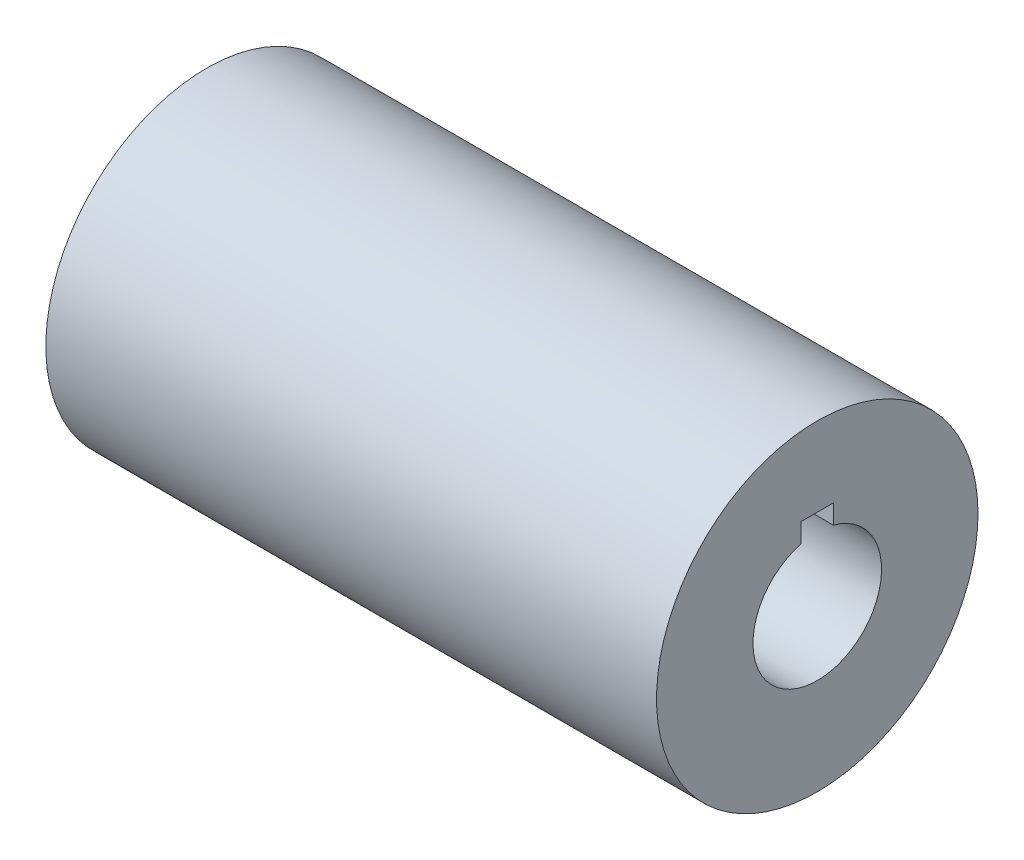
ISO-10303-21;
HEADER;
FILE_DESCRIPTION(('STEP AP214'),'2;1');
FILE_NAME('part.step','',(''),(''),'','','');
FILE_SCHEMA(('AUTOMOTIVE_DESIGN { 1 0 10303 214 1 1 1 1 }'));
ENDSEC;
DATA;
#1=APPLICATION_CONTEXT('core data for automotive mechanical design processes');
#2=APPLICATION_PROTOCOL_DEFINITION('international standard','automotive_design',2000,#1);
#3=PRODUCT_CONTEXT('',#1,'mechanical');
#4=PRODUCT('Part','Part','',(#3));
#5=PRODUCT_RELATED_PRODUCT_CATEGORY('part','',(#4));
#6=PRODUCT_DEFINITION_FORMATION('','',#4);
#7=PRODUCT_DEFINITION_CONTEXT('part definition',#1,'design');
#8=PRODUCT_DEFINITION('design','',#6,#7);
#9=PRODUCT_DEFINITION_SHAPE('','',#8);
#10=(LENGTH_UNIT() NAMED_UNIT(*) SI_UNIT(.MILLI.,.METRE.));
#11=(NAMED_UNIT(*) PLANE_ANGLE_UNIT() SI_UNIT($,.RADIAN.));
#12=(NAMED_UNIT(*) SI_UNIT($,.STERADIAN.) SOLID_ANGLE_UNIT());
#13=UNCERTAINTY_MEASURE_WITH_UNIT(LENGTH_MEASURE(1.E-05),#10,'distance_accuracy_value','');
#14=(GEOMETRIC_REPRESENTATION_CONTEXT(3) GLOBAL_UNCERTAINTY_ASSIGNED_CONTEXT((#13)) GLOBAL_UNIT_ASSIGNED_CONTEXT((#10,
#11,#12)) REPRESENTATION_CONTEXT('',''));
#15=CARTESIAN_POINT('',(0.,0.,0.));
#16=DIRECTION('',(0.,0.,1.));
#17=DIRECTION('',(1.,0.,0.));
#18=AXIS2_PLACEMENT_3D('',#15,#16,#17);
#19=CARTESIAN_POINT('',(0.,0.,0.));
#20=DIRECTION('',(1.,0.,0.));
#21=DIRECTION('',(0.,0.,-1.));
#22=AXIS2_PLACEMENT_3D('',#19,#20,#21);
#23=CYLINDRICAL_SURFACE('',#22,4.);
#24=CARTESIAN_POINT('',(38.,0.,0.));
#25=DIRECTION('',(1.,0.,0.));
#26=DIRECTION('',(0.,0.,-1.));
#27=AXIS2_PLACEMENT_3D('',#24,#25,#26);
#28=CIRCLE('',#27,4.);
#29=CARTESIAN_POINT('',(38.,3.87298334620742,1.));
#30=VERTEX_POINT('',#29);
#31=CARTESIAN_POINT('',(38.,3.87298334620742,-1.));
#32=VERTEX_POINT('',#31);
#33=EDGE_CURVE('E122',#30,#32,#28,.T.);
#34=ORIENTED_EDGE('',*,*,#33,.T.);
#35=DIRECTION('',(1.,0.,0.));
#36=VECTOR('',#35,1.);
#37=CARTESIAN_POINT('',(18.,3.87298334620742,-1.));
#38=LINE('',#37,#36);
#39=CARTESIAN_POINT('',(18.,3.87298334620742,-1.));
#40=VERTEX_POINT('',#39);
#41=EDGE_CURVE('E112',#40,#32,#38,.T.);
#42=ORIENTED_EDGE('',*,*,#41,.F.);
#43=CARTESIAN_POINT('',(18.,0.,0.));
#44=DIRECTION('',(-1.,0.,0.));
#45=DIRECTION('',(0.,0.,1.));
#46=AXIS2_PLACEMENT_3D('',#43,#44,#45);
#47=CIRCLE('',#46,4.);
#48=CARTESIAN_POINT('',(18.,3.87298334620742,1.));
#49=VERTEX_POINT('',#48);
#50=EDGE_CURVE('E37',#49,#40,#47,.F.);
#51=ORIENTED_EDGE('',*,*,#50,.F.);
#52=DIRECTION('',(1.,0.,0.));
#53=VECTOR('',#52,1.);
#54=CARTESIAN_POINT('',(18.,3.87298334620742,1.));
#55=LINE('',#54,#53);
#56=EDGE_CURVE('E102',#49,#30,#55,.T.);
#57=ORIENTED_EDGE('',*,*,#56,.T.);
#58=EDGE_LOOP('',(#34,#42,#51,#57));
#59=FACE_BOUND('',#58,.T.);
#60=ADVANCED_FACE('F33',(#59),#23,.F.);
#61=CARTESIAN_POINT('',(38.,0.,0.));
#62=DIRECTION('',(-1.,0.,0.));
#63=DIRECTION('',(0.,0.,1.));
#64=AXIS2_PLACEMENT_3D('',#61,#62,#63);
#65=CYLINDRICAL_SURFACE('',#64,10.);
#66=CARTESIAN_POINT('',(38.,0.,0.));
#67=DIRECTION('',(1.,0.,0.));
#68=DIRECTION('',(0.,0.,-1.));
#69=AXIS2_PLACEMENT_3D('',#66,#67,#68);
#70=CIRCLE('',#69,10.);
#71=CARTESIAN_POINT('',(38.,0.,-10.));
#72=VERTEX_POINT('',#71);
#73=EDGE_CURVE('E11',#72,#72,#70,.T.);
#74=ORIENTED_EDGE('',*,*,#73,.F.);
#75=EDGE_LOOP('',(#74));
#76=FACE_BOUND('',#75,.T.);
#77=CARTESIAN_POINT('',(0.,0.,0.));
#78=DIRECTION('',(1.,0.,0.));
#79=DIRECTION('',(0.,0.,-1.));
#80=AXIS2_PLACEMENT_3D('',#77,#78,#79);
#81=CIRCLE('',#80,10.);
#82=CARTESIAN_POINT('',(0.,0.,-10.));
#83=VERTEX_POINT('',#82);
#84=EDGE_CURVE('E42',#83,#83,#81,.T.);
#85=ORIENTED_EDGE('',*,*,#84,.T.);
#86=EDGE_LOOP('',(#85));
#87=FACE_BOUND('',#86,.T.);
#88=ADVANCED_FACE('F35',(#76,#87),#65,.T.);
#89=CARTESIAN_POINT('',(38.,0.,0.));
#90=DIRECTION('',(1.,0.,0.));
#91=DIRECTION('',(0.,0.,-1.));
#92=AXIS2_PLACEMENT_3D('',#89,#90,#91);
#93=PLANE('',#92);
#94=DIRECTION('',(0.,-1.,0.));
#95=VECTOR('',#94,1.);
#96=CARTESIAN_POINT('',(38.,3.87298334620742,1.));
#97=LINE('',#96,#95);
#98=CARTESIAN_POINT('',(38.,5.07298334620742,1.));
#99=VERTEX_POINT('',#98);
#100=EDGE_CURVE('E107',#99,#30,#97,.T.);
#101=ORIENTED_EDGE('',*,*,#100,.F.);
#102=DIRECTION('',(0.,0.,1.));
#103=VECTOR('',#102,1.);
#104=CARTESIAN_POINT('',(38.,5.07298334620742,1.));
#105=LINE('',#104,#103);
#106=CARTESIAN_POINT('',(38.,5.07298334620742,-1.));
#107=VERTEX_POINT('',#106);
#108=EDGE_CURVE('E119',#107,#99,#105,.T.);
#109=ORIENTED_EDGE('',*,*,#108,.F.);
#110=DIRECTION('',(0.,1.,0.));
#111=VECTOR('',#110,1.);
#112=CARTESIAN_POINT('',(38.,3.87298334620742,-1.));
#113=LINE('',#112,#111);
#114=EDGE_CURVE('E190',#32,#107,#113,.T.);
#115=ORIENTED_EDGE('',*,*,#114,.F.);
#116=ORIENTED_EDGE('',*,*,#33,.F.);
#117=EDGE_LOOP('',(#101,#109,#115,#116));
#118=FACE_BOUND('',#117,.T.);
#119=ORIENTED_EDGE('',*,*,#73,.T.);
#120=EDGE_LOOP('',(#119));
#121=FACE_BOUND('',#120,.T.);
#122=ADVANCED_FACE('F141',(#118,#121),#93,.T.);
#123=CARTESIAN_POINT('',(0.,0.,0.));
#124=DIRECTION('',(1.,0.,0.));
#125=DIRECTION('',(0.,0.,-1.));
#126=AXIS2_PLACEMENT_3D('',#123,#124,#125);
#127=PLANE('',#126);
#128=CARTESIAN_POINT('',(0.,0.,0.));
#129=DIRECTION('',(-1.,0.,0.));
#130=DIRECTION('',(0.,0.,1.));
#131=AXIS2_PLACEMENT_3D('',#128,#129,#130);
#132=CIRCLE('',#131,4.5);
#133=CARTESIAN_POINT('',(0.,4.24264068711928,-1.5));
#134=VERTEX_POINT('',#133);
#135=CARTESIAN_POINT('',(0.,4.24264068711928,1.5));
#136=VERTEX_POINT('',#135);
#137=EDGE_CURVE('E125',#134,#136,#132,.T.);
#138=ORIENTED_EDGE('',*,*,#137,.F.);
#139=DIRECTION('',(0.,-1.,0.));
#140=VECTOR('',#139,1.);
#141=CARTESIAN_POINT('',(0.,4.24264068711928,-1.5));
#142=LINE('',#141,#140);
#143=CARTESIAN_POINT('',(0.,5.84264068711928,-1.5));
#144=VERTEX_POINT('',#143);
#145=EDGE_CURVE('E199',#144,#134,#142,.T.);
#146=ORIENTED_EDGE('',*,*,#145,.F.);
#147=DIRECTION('',(0.,0.,-1.));
#148=VECTOR('',#147,1.);
#149=CARTESIAN_POINT('',(0.,5.84264068711928,-1.5));
#150=LINE('',#149,#148);
#151=CARTESIAN_POINT('',(0.,5.84264068711928,1.5));
#152=VERTEX_POINT('',#151);
#153=EDGE_CURVE('E204',#152,#144,#150,.T.);
#154=ORIENTED_EDGE('',*,*,#153,.F.);
#155=DIRECTION('',(0.,1.,0.));
#156=VECTOR('',#155,1.);
#157=CARTESIAN_POINT('',(0.,4.24264068711928,1.5));
#158=LINE('',#157,#156);
#159=EDGE_CURVE('E209',#136,#152,#158,.T.);
#160=ORIENTED_EDGE('',*,*,#159,.F.);
#161=EDGE_LOOP('',(#138,#146,#154,#160));
#162=FACE_BOUND('',#161,.T.);
#163=ORIENTED_EDGE('',*,*,#84,.F.);
#164=EDGE_LOOP('',(#163));
#165=FACE_BOUND('',#164,.T.);
#166=ADVANCED_FACE('F139',(#162,#165),#127,.F.);
#167=CARTESIAN_POINT('',(18.,0.,0.));
#168=DIRECTION('',(-1.,0.,0.));
#169=DIRECTION('',(0.,0.,1.));
#170=AXIS2_PLACEMENT_3D('',#167,#168,#169);
#171=PLANE('',#170);
#172=DIRECTION('',(0.,-1.,0.));
#173=VECTOR('',#172,1.);
#174=CARTESIAN_POINT('',(18.,3.87298334620742,1.));
#175=LINE('',#174,#173);
#176=CARTESIAN_POINT('',(18.,5.07298334620742,1.));
#177=VERTEX_POINT('',#176);
#178=EDGE_CURVE('E105',#177,#49,#175,.T.);
#179=ORIENTED_EDGE('',*,*,#178,.T.);
#180=ORIENTED_EDGE('',*,*,#50,.T.);
#181=DIRECTION('',(0.,1.,0.));
#182=VECTOR('',#181,1.);
#183=CARTESIAN_POINT('',(18.,3.87298334620742,-1.));
#184=LINE('',#183,#182);
#185=CARTESIAN_POINT('',(18.,5.07298334620742,-1.));
#186=VERTEX_POINT('',#185);
#187=EDGE_CURVE('E118',#40,#186,#184,.T.);
#188=ORIENTED_EDGE('',*,*,#187,.T.);
#189=DIRECTION('',(0.,0.,1.));
#190=VECTOR('',#189,1.);
#191=CARTESIAN_POINT('',(18.,5.07298334620742,1.));
#192=LINE('',#191,#190);
#193=EDGE_CURVE('E50',#186,#177,#192,.T.);
#194=ORIENTED_EDGE('',*,*,#193,.T.);
#195=EDGE_LOOP('',(#179,#180,#188,#194));
#196=FACE_BOUND('',#195,.T.);
#197=CARTESIAN_POINT('',(18.,0.,0.));
#198=DIRECTION('',(-1.,0.,0.));
#199=DIRECTION('',(0.,0.,1.));
#200=AXIS2_PLACEMENT_3D('',#197,#198,#199);
#201=CIRCLE('',#200,4.5);
#202=CARTESIAN_POINT('',(18.,4.24264068711928,-1.5));
#203=VERTEX_POINT('',#202);
#204=CARTESIAN_POINT('',(18.,4.24264068711928,1.5));
#205=VERTEX_POINT('',#204);
#206=EDGE_CURVE('E123',#203,#205,#201,.T.);
#207=ORIENTED_EDGE('',*,*,#206,.T.);
#208=DIRECTION('',(0.,1.,0.));
#209=VECTOR('',#208,1.);
#210=CARTESIAN_POINT('',(18.,4.24264068711928,1.5));
#211=LINE('',#210,#209);
#212=CARTESIAN_POINT('',(18.,5.84264068711928,1.5));
#213=VERTEX_POINT('',#212);
#214=EDGE_CURVE('E203',#205,#213,#211,.T.);
#215=ORIENTED_EDGE('',*,*,#214,.T.);
#216=DIRECTION('',(0.,0.,-1.));
#217=VECTOR('',#216,1.);
#218=CARTESIAN_POINT('',(18.,5.84264068711928,-1.5));
#219=LINE('',#218,#217);
#220=CARTESIAN_POINT('',(18.,5.84264068711928,-1.5));
#221=VERTEX_POINT('',#220);
#222=EDGE_CURVE('E206',#213,#221,#219,.T.);
#223=ORIENTED_EDGE('',*,*,#222,.T.);
#224=DIRECTION('',(0.,-1.,0.));
#225=VECTOR('',#224,1.);
#226=CARTESIAN_POINT('',(18.,4.24264068711928,-1.5));
#227=LINE('',#226,#225);
#228=EDGE_CURVE('E58',#221,#203,#227,.T.);
#229=ORIENTED_EDGE('',*,*,#228,.T.);
#230=EDGE_LOOP('',(#207,#215,#223,#229));
#231=FACE_BOUND('',#230,.T.);
#232=ADVANCED_FACE('F116',(#196,#231),#171,.T.);
#233=CARTESIAN_POINT('',(18.,0.,0.));
#234=DIRECTION('',(-1.,0.,0.));
#235=DIRECTION('',(0.,0.,1.));
#236=AXIS2_PLACEMENT_3D('',#233,#234,#235);
#237=CYLINDRICAL_SURFACE('',#236,4.5);
#238=ORIENTED_EDGE('',*,*,#137,.T.);
#239=DIRECTION('',(-1.,0.,0.));
#240=VECTOR('',#239,1.);
#241=CARTESIAN_POINT('',(18.,4.24264068711928,1.5));
#242=LINE('',#241,#240);
#243=EDGE_CURVE('E216',#205,#136,#242,.T.);
#244=ORIENTED_EDGE('',*,*,#243,.F.);
#245=ORIENTED_EDGE('',*,*,#206,.F.);
#246=DIRECTION('',(-1.,0.,0.));
#247=VECTOR('',#246,1.);
#248=CARTESIAN_POINT('',(18.,4.24264068711928,-1.5));
#249=LINE('',#248,#247);
#250=EDGE_CURVE('E133',#203,#134,#249,.T.);
#251=ORIENTED_EDGE('',*,*,#250,.T.);
#252=EDGE_LOOP('',(#238,#244,#245,#251));
#253=FACE_BOUND('',#252,.T.);
#254=ADVANCED_FACE('F147',(#253),#237,.F.);
#255=CARTESIAN_POINT('',(18.,4.24264068711928,-1.5));
#256=DIRECTION('',(0.,0.,-1.));
#257=DIRECTION('',(-1.,0.,0.));
#258=AXIS2_PLACEMENT_3D('',#255,#256,#257);
#259=PLANE('',#258);
#260=ORIENTED_EDGE('',*,*,#145,.T.);
#261=ORIENTED_EDGE('',*,*,#250,.F.);
#262=ORIENTED_EDGE('',*,*,#228,.F.);
#263=DIRECTION('',(-1.,0.,0.));
#264=VECTOR('',#263,1.);
#265=CARTESIAN_POINT('',(18.,5.84264068711928,-1.5));
#266=LINE('',#265,#264);
#267=EDGE_CURVE('E130',#221,#144,#266,.T.);
#268=ORIENTED_EDGE('',*,*,#267,.T.);
#269=EDGE_LOOP('',(#260,#261,#262,#268));
#270=FACE_BOUND('',#269,.T.);
#271=ADVANCED_FACE('F160',(#270),#259,.F.);
#272=CARTESIAN_POINT('',(18.,5.84264068711928,-1.5));
#273=DIRECTION('',(0.,1.,0.));
#274=DIRECTION('',(0.,0.,1.));
#275=AXIS2_PLACEMENT_3D('',#272,#273,#274);
#276=PLANE('',#275);
#277=ORIENTED_EDGE('',*,*,#153,.T.);
#278=ORIENTED_EDGE('',*,*,#267,.F.);
#279=ORIENTED_EDGE('',*,*,#222,.F.);
#280=DIRECTION('',(-1.,0.,0.));
#281=VECTOR('',#280,1.);
#282=CARTESIAN_POINT('',(18.,5.84264068711928,1.5));
#283=LINE('',#282,#281);
#284=EDGE_CURVE('E215',#213,#152,#283,.T.);
#285=ORIENTED_EDGE('',*,*,#284,.T.);
#286=EDGE_LOOP('',(#277,#278,#279,#285));
#287=FACE_BOUND('',#286,.T.);
#288=ADVANCED_FACE('F165',(#287),#276,.F.);
#289=CARTESIAN_POINT('',(18.,4.24264068711928,1.5));
#290=DIRECTION('',(0.,0.,1.));
#291=DIRECTION('',(1.,0.,0.));
#292=AXIS2_PLACEMENT_3D('',#289,#290,#291);
#293=PLANE('',#292);
#294=ORIENTED_EDGE('',*,*,#159,.T.);
#295=ORIENTED_EDGE('',*,*,#284,.F.);
#296=ORIENTED_EDGE('',*,*,#214,.F.);
#297=ORIENTED_EDGE('',*,*,#243,.T.);
#298=EDGE_LOOP('',(#294,#295,#296,#297));
#299=FACE_BOUND('',#298,.T.);
#300=ADVANCED_FACE('F167',(#299),#293,.F.);
#301=CARTESIAN_POINT('',(18.,3.87298334620742,1.));
#302=DIRECTION('',(0.,0.,1.));
#303=DIRECTION('',(1.,0.,0.));
#304=AXIS2_PLACEMENT_3D('',#301,#302,#303);
#305=PLANE('',#304);
#306=ORIENTED_EDGE('',*,*,#100,.T.);
#307=ORIENTED_EDGE('',*,*,#56,.F.);
#308=ORIENTED_EDGE('',*,*,#178,.F.);
#309=DIRECTION('',(1.,0.,0.));
#310=VECTOR('',#309,1.);
#311=CARTESIAN_POINT('',(18.,5.07298334620742,1.));
#312=LINE('',#311,#310);
#313=EDGE_CURVE('E186',#177,#99,#312,.T.);
#314=ORIENTED_EDGE('',*,*,#313,.T.);
#315=EDGE_LOOP('',(#306,#307,#308,#314));
#316=FACE_BOUND('',#315,.T.);
#317=ADVANCED_FACE('F104',(#316),#305,.F.);
#318=CARTESIAN_POINT('',(18.,5.07298334620742,1.));
#319=DIRECTION('',(0.,1.,0.));
#320=DIRECTION('',(0.,0.,1.));
#321=AXIS2_PLACEMENT_3D('',#318,#319,#320);
#322=PLANE('',#321);
#323=ORIENTED_EDGE('',*,*,#108,.T.);
#324=ORIENTED_EDGE('',*,*,#313,.F.);
#325=ORIENTED_EDGE('',*,*,#193,.F.);
#326=DIRECTION('',(1.,0.,0.));
#327=VECTOR('',#326,1.);
#328=CARTESIAN_POINT('',(18.,5.07298334620742,-1.));
#329=LINE('',#328,#327);
#330=EDGE_CURVE('E187',#186,#107,#329,.T.);
#331=ORIENTED_EDGE('',*,*,#330,.T.);
#332=EDGE_LOOP('',(#323,#324,#325,#331));
#333=FACE_BOUND('',#332,.T.);
#334=ADVANCED_FACE('F176',(#333),#322,.F.);
#335=CARTESIAN_POINT('',(18.,3.87298334620742,-1.));
#336=DIRECTION('',(0.,0.,-1.));
#337=DIRECTION('',(-1.,0.,0.));
#338=AXIS2_PLACEMENT_3D('',#335,#336,#337);
#339=PLANE('',#338);
#340=ORIENTED_EDGE('',*,*,#114,.T.);
#341=ORIENTED_EDGE('',*,*,#330,.F.);
#342=ORIENTED_EDGE('',*,*,#187,.F.);
#343=ORIENTED_EDGE('',*,*,#41,.T.);
#344=EDGE_LOOP('',(#340,#341,#342,#343));
#345=FACE_BOUND('',#344,.T.);
#346=ADVANCED_FACE('F177',(#345),#339,.F.);
#347=CLOSED_SHELL('',(#60,#88,#122,#166,#232,#254,#271,#288,#300,#317,#334,#346));
#348=MANIFOLD_SOLID_BREP('B2',#347);
#349=ADVANCED_BREP_SHAPE_REPRESENTATION('',(#18,#348),#14);
#350=SHAPE_DEFINITION_REPRESENTATION(#9,#349);
ENDSEC;
END-ISO-10303-21;
